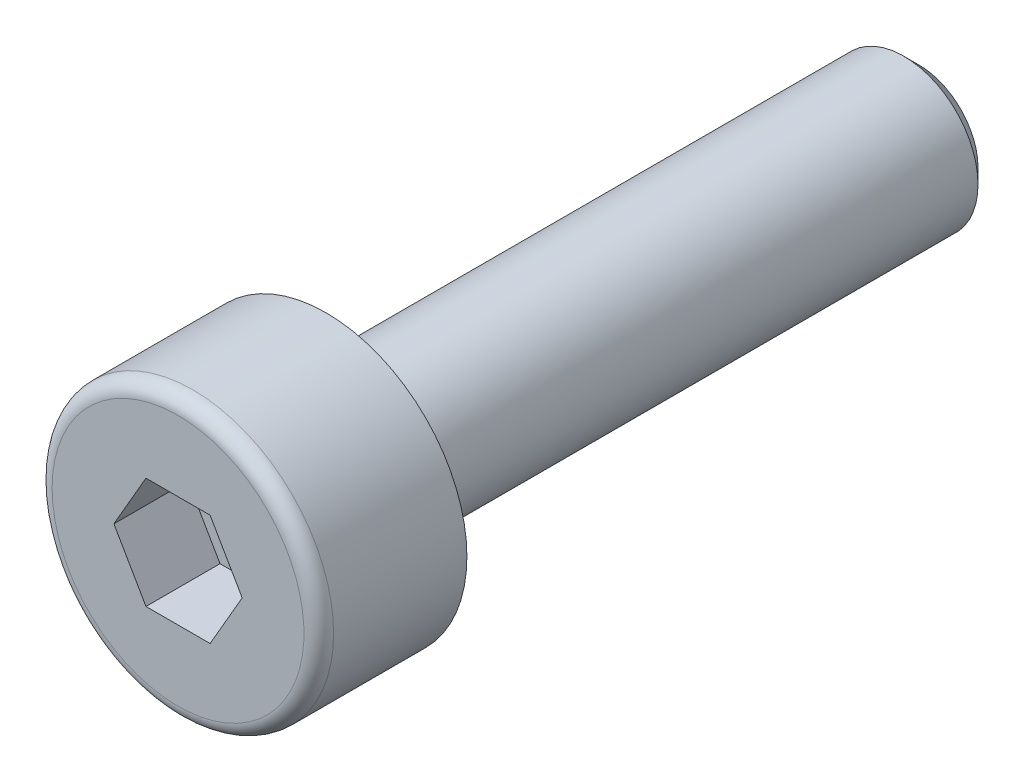
ISO-10303-21;
HEADER;
FILE_DESCRIPTION(('STEP AP214'),'2;1');
FILE_NAME('part.step','',(''),(''),'','','');
FILE_SCHEMA(('AUTOMOTIVE_DESIGN { 1 0 10303 214 1 1 1 1 }'));
ENDSEC;
DATA;
#1=APPLICATION_CONTEXT('core data for automotive mechanical design processes');
#2=APPLICATION_PROTOCOL_DEFINITION('international standard','automotive_design',2000,#1);
#3=PRODUCT_CONTEXT('',#1,'mechanical');
#4=PRODUCT('Part','Part','',(#3));
#5=PRODUCT_RELATED_PRODUCT_CATEGORY('part','',(#4));
#6=PRODUCT_DEFINITION_FORMATION('','',#4);
#7=PRODUCT_DEFINITION_CONTEXT('part definition',#1,'design');
#8=PRODUCT_DEFINITION('design','',#6,#7);
#9=PRODUCT_DEFINITION_SHAPE('','',#8);
#10=(LENGTH_UNIT() NAMED_UNIT(*) SI_UNIT(.MILLI.,.METRE.));
#11=(NAMED_UNIT(*) PLANE_ANGLE_UNIT() SI_UNIT($,.RADIAN.));
#12=(NAMED_UNIT(*) SI_UNIT($,.STERADIAN.) SOLID_ANGLE_UNIT());
#13=UNCERTAINTY_MEASURE_WITH_UNIT(LENGTH_MEASURE(1.E-05),#10,'distance_accuracy_value','');
#14=(GEOMETRIC_REPRESENTATION_CONTEXT(3) GLOBAL_UNCERTAINTY_ASSIGNED_CONTEXT((#13)) GLOBAL_UNIT_ASSIGNED_CONTEXT((#10,
#11,#12)) REPRESENTATION_CONTEXT('',''));
#15=CARTESIAN_POINT('',(0.,0.,0.));
#16=DIRECTION('',(0.,0.,1.));
#17=DIRECTION('',(1.,0.,0.));
#18=AXIS2_PLACEMENT_3D('',#15,#16,#17);
#19=CARTESIAN_POINT('',(0.,0.,0.));
#20=DIRECTION('',(0.,0.,-1.));
#21=DIRECTION('',(-1.,0.,0.));
#22=AXIS2_PLACEMENT_3D('',#19,#20,#21);
#23=PLANE('',#22);
#24=CARTESIAN_POINT('',(0.,0.,0.));
#25=DIRECTION('',(0.,0.,-1.));
#26=DIRECTION('',(-1.,0.,0.));
#27=AXIS2_PLACEMENT_3D('',#24,#25,#26);
#28=CIRCLE('',#27,1.7);
#29=CARTESIAN_POINT('',(-1.7,0.,0.));
#30=VERTEX_POINT('',#29);
#31=EDGE_CURVE('E160',#30,#30,#28,.F.);
#32=ORIENTED_EDGE('',*,*,#31,.T.);
#33=EDGE_LOOP('',(#32));
#34=FACE_BOUND('',#33,.T.);
#35=DIRECTION('',(-0.5,0.866025403784438,0.));
#36=VECTOR('',#35,1.);
#37=CARTESIAN_POINT('',(0.866025403784439,0.,0.));
#38=LINE('',#37,#36);
#39=CARTESIAN_POINT('',(0.866025403784439,0.,0.));
#40=VERTEX_POINT('',#39);
#41=CARTESIAN_POINT('',(0.433012701892219,0.75,0.));
#42=VERTEX_POINT('',#41);
#43=EDGE_CURVE('E135',#40,#42,#38,.T.);
#44=ORIENTED_EDGE('',*,*,#43,.F.);
#45=DIRECTION('',(0.5,0.866025403784439,0.));
#46=VECTOR('',#45,1.);
#47=CARTESIAN_POINT('',(0.433012701892219,-0.750000000000001,0.));
#48=LINE('',#47,#46);
#49=CARTESIAN_POINT('',(0.433012701892219,-0.750000000000001,0.));
#50=VERTEX_POINT('',#49);
#51=EDGE_CURVE('E61',#50,#40,#48,.T.);
#52=ORIENTED_EDGE('',*,*,#51,.F.);
#53=DIRECTION('',(1.,0.,0.));
#54=VECTOR('',#53,1.);
#55=CARTESIAN_POINT('',(-0.433012701892219,-0.750000000000001,0.));
#56=LINE('',#55,#54);
#57=CARTESIAN_POINT('',(-0.433012701892219,-0.750000000000001,0.));
#58=VERTEX_POINT('',#57);
#59=EDGE_CURVE('E144',#58,#50,#56,.T.);
#60=ORIENTED_EDGE('',*,*,#59,.F.);
#61=DIRECTION('',(0.5,-0.866025403784439,0.));
#62=VECTOR('',#61,1.);
#63=CARTESIAN_POINT('',(-0.866025403784438,0.,0.));
#64=LINE('',#63,#62);
#65=CARTESIAN_POINT('',(-0.866025403784438,0.,0.));
#66=VERTEX_POINT('',#65);
#67=EDGE_CURVE('E142',#66,#58,#64,.T.);
#68=ORIENTED_EDGE('',*,*,#67,.F.);
#69=DIRECTION('',(-0.5,-0.866025403784439,0.));
#70=VECTOR('',#69,1.);
#71=CARTESIAN_POINT('',(-0.433012701892219,0.75,0.));
#72=LINE('',#71,#70);
#73=CARTESIAN_POINT('',(-0.433012701892219,0.75,0.));
#74=VERTEX_POINT('',#73);
#75=EDGE_CURVE('E109',#74,#66,#72,.T.);
#76=ORIENTED_EDGE('',*,*,#75,.F.);
#77=DIRECTION('',(-1.,0.,0.));
#78=VECTOR('',#77,1.);
#79=CARTESIAN_POINT('',(0.433012701892219,0.75,0.));
#80=LINE('',#79,#78);
#81=EDGE_CURVE('E138',#42,#74,#80,.T.);
#82=ORIENTED_EDGE('',*,*,#81,.F.);
#83=EDGE_LOOP('',(#44,#52,#60,#68,#76,#82));
#84=FACE_BOUND('',#83,.T.);
#85=ADVANCED_FACE('F45',(#34,#84),#23,.F.);
#86=CARTESIAN_POINT('',(0.,0.,0.));
#87=DIRECTION('',(0.,0.,1.));
#88=DIRECTION('',(1.,0.,0.));
#89=AXIS2_PLACEMENT_3D('',#86,#87,#88);
#90=CYLINDRICAL_SURFACE('',#89,1.9);
#91=CARTESIAN_POINT('',(0.,0.,-0.2));
#92=DIRECTION('',(0.,0.,-1.));
#93=DIRECTION('',(-1.,0.,0.));
#94=AXIS2_PLACEMENT_3D('',#91,#92,#93);
#95=CIRCLE('',#94,1.9);
#96=CARTESIAN_POINT('',(-1.9,0.,-0.2));
#97=VERTEX_POINT('',#96);
#98=EDGE_CURVE('E163',#97,#97,#95,.T.);
#99=ORIENTED_EDGE('',*,*,#98,.T.);
#100=EDGE_LOOP('',(#99));
#101=FACE_BOUND('',#100,.T.);
#102=CARTESIAN_POINT('',(0.,0.,-2.));
#103=DIRECTION('',(0.,0.,1.));
#104=DIRECTION('',(1.,0.,0.));
#105=AXIS2_PLACEMENT_3D('',#102,#103,#104);
#106=CIRCLE('',#105,1.9);
#107=CARTESIAN_POINT('',(1.9,0.,-2.));
#108=VERTEX_POINT('',#107);
#109=EDGE_CURVE('E156',#108,#108,#106,.T.);
#110=ORIENTED_EDGE('',*,*,#109,.T.);
#111=EDGE_LOOP('',(#110));
#112=FACE_BOUND('',#111,.T.);
#113=ADVANCED_FACE('F180',(#101,#112),#90,.T.);
#114=CARTESIAN_POINT('',(0.,1.9,-2.));
#115=DIRECTION('',(0.,0.,1.));
#116=DIRECTION('',(1.,0.,0.));
#117=AXIS2_PLACEMENT_3D('',#114,#115,#116);
#118=PLANE('',#117);
#119=ORIENTED_EDGE('',*,*,#109,.F.);
#120=EDGE_LOOP('',(#119));
#121=FACE_BOUND('',#120,.T.);
#122=CARTESIAN_POINT('',(0.,0.,-2.));
#123=DIRECTION('',(0.,0.,1.));
#124=DIRECTION('',(1.,0.,0.));
#125=AXIS2_PLACEMENT_3D('',#122,#123,#124);
#126=CIRCLE('',#125,1.);
#127=CARTESIAN_POINT('',(1.,0.,-2.));
#128=VERTEX_POINT('',#127);
#129=EDGE_CURVE('E148',#128,#128,#126,.T.);
#130=ORIENTED_EDGE('',*,*,#129,.T.);
#131=EDGE_LOOP('',(#130));
#132=FACE_BOUND('',#131,.T.);
#133=ADVANCED_FACE('F186',(#121,#132),#118,.F.);
#134=CARTESIAN_POINT('',(0.,0.,0.));
#135=DIRECTION('',(0.,0.,1.));
#136=DIRECTION('',(1.,0.,0.));
#137=AXIS2_PLACEMENT_3D('',#134,#135,#136);
#138=CYLINDRICAL_SURFACE('',#137,1.);
#139=CARTESIAN_POINT('',(0.,0.,-9.8));
#140=DIRECTION('',(0.,0.,1.));
#141=DIRECTION('',(1.,0.,0.));
#142=AXIS2_PLACEMENT_3D('',#139,#140,#141);
#143=CIRCLE('',#142,1.);
#144=CARTESIAN_POINT('',(1.,0.,-9.8));
#145=VERTEX_POINT('',#144);
#146=EDGE_CURVE('E54',#145,#145,#143,.T.);
#147=ORIENTED_EDGE('',*,*,#146,.T.);
#148=EDGE_LOOP('',(#147));
#149=FACE_BOUND('',#148,.T.);
#150=ORIENTED_EDGE('',*,*,#129,.F.);
#151=EDGE_LOOP('',(#150));
#152=FACE_BOUND('',#151,.T.);
#153=ADVANCED_FACE('F168',(#149,#152),#138,.T.);
#154=CARTESIAN_POINT('',(0.,1.,-10.));
#155=DIRECTION('',(0.,0.,1.));
#156=DIRECTION('',(1.,0.,0.));
#157=AXIS2_PLACEMENT_3D('',#154,#155,#156);
#158=PLANE('',#157);
#159=CARTESIAN_POINT('',(0.,0.,-10.));
#160=DIRECTION('',(0.,0.,1.));
#161=DIRECTION('',(1.,0.,0.));
#162=AXIS2_PLACEMENT_3D('',#159,#160,#161);
#163=CIRCLE('',#162,0.799999999999999);
#164=CARTESIAN_POINT('',(0.799999999999999,0.,-10.));
#165=VERTEX_POINT('',#164);
#166=EDGE_CURVE('E11',#165,#165,#163,.F.);
#167=ORIENTED_EDGE('',*,*,#166,.T.);
#168=EDGE_LOOP('',(#167));
#169=FACE_BOUND('',#168,.T.);
#170=ADVANCED_FACE('F196',(#169),#158,.F.);
#171=CARTESIAN_POINT('',(0.433012701892219,-0.750000000000001,-1.));
#172=DIRECTION('',(0.866025403784439,-0.5,0.));
#173=DIRECTION('',(0.5,0.866025403784439,0.));
#174=AXIS2_PLACEMENT_3D('',#171,#172,#173);
#175=PLANE('',#174);
#176=ORIENTED_EDGE('',*,*,#51,.T.);
#177=DIRECTION('',(0.,0.,1.));
#178=VECTOR('',#177,1.);
#179=CARTESIAN_POINT('',(0.866025403784439,0.,-1.));
#180=LINE('',#179,#178);
#181=CARTESIAN_POINT('',(0.866025403784439,0.,-1.));
#182=VERTEX_POINT('',#181);
#183=EDGE_CURVE('E91',#182,#40,#180,.T.);
#184=ORIENTED_EDGE('',*,*,#183,.F.);
#185=DIRECTION('',(0.5,0.866025403784439,0.));
#186=VECTOR('',#185,1.);
#187=CARTESIAN_POINT('',(0.433012701892219,-0.750000000000001,-1.));
#188=LINE('',#187,#186);
#189=CARTESIAN_POINT('',(0.433012701892219,-0.750000000000001,-1.));
#190=VERTEX_POINT('',#189);
#191=EDGE_CURVE('E146',#190,#182,#188,.T.);
#192=ORIENTED_EDGE('',*,*,#191,.F.);
#193=DIRECTION('',(0.,0.,1.));
#194=VECTOR('',#193,1.);
#195=CARTESIAN_POINT('',(0.433012701892219,-0.750000000000001,-1.));
#196=LINE('',#195,#194);
#197=EDGE_CURVE('E69',#190,#50,#196,.T.);
#198=ORIENTED_EDGE('',*,*,#197,.T.);
#199=EDGE_LOOP('',(#176,#184,#192,#198));
#200=FACE_BOUND('',#199,.T.);
#201=ADVANCED_FACE('F199',(#200),#175,.F.);
#202=CARTESIAN_POINT('',(-0.433012701892219,-0.750000000000001,-1.));
#203=DIRECTION('',(0.,-1.,0.));
#204=DIRECTION('',(1.,0.,0.));
#205=AXIS2_PLACEMENT_3D('',#202,#203,#204);
#206=PLANE('',#205);
#207=ORIENTED_EDGE('',*,*,#59,.T.);
#208=ORIENTED_EDGE('',*,*,#197,.F.);
#209=DIRECTION('',(1.,0.,0.));
#210=VECTOR('',#209,1.);
#211=CARTESIAN_POINT('',(-0.433012701892219,-0.750000000000001,-1.));
#212=LINE('',#211,#210);
#213=CARTESIAN_POINT('',(-0.433012701892219,-0.750000000000001,-1.));
#214=VERTEX_POINT('',#213);
#215=EDGE_CURVE('E121',#214,#190,#212,.T.);
#216=ORIENTED_EDGE('',*,*,#215,.F.);
#217=DIRECTION('',(0.,0.,1.));
#218=VECTOR('',#217,1.);
#219=CARTESIAN_POINT('',(-0.433012701892219,-0.750000000000001,-1.));
#220=LINE('',#219,#218);
#221=EDGE_CURVE('E113',#214,#58,#220,.T.);
#222=ORIENTED_EDGE('',*,*,#221,.T.);
#223=EDGE_LOOP('',(#207,#208,#216,#222));
#224=FACE_BOUND('',#223,.T.);
#225=ADVANCED_FACE('F203',(#224),#206,.F.);
#226=CARTESIAN_POINT('',(-0.866025403784438,0.,-1.));
#227=DIRECTION('',(-0.866025403784439,-0.5,0.));
#228=DIRECTION('',(0.5,-0.866025403784439,0.));
#229=AXIS2_PLACEMENT_3D('',#226,#227,#228);
#230=PLANE('',#229);
#231=ORIENTED_EDGE('',*,*,#67,.T.);
#232=ORIENTED_EDGE('',*,*,#221,.F.);
#233=DIRECTION('',(0.5,-0.866025403784439,0.));
#234=VECTOR('',#233,1.);
#235=CARTESIAN_POINT('',(-0.866025403784438,0.,-1.));
#236=LINE('',#235,#234);
#237=CARTESIAN_POINT('',(-0.866025403784438,0.,-1.));
#238=VERTEX_POINT('',#237);
#239=EDGE_CURVE('E117',#238,#214,#236,.T.);
#240=ORIENTED_EDGE('',*,*,#239,.F.);
#241=DIRECTION('',(0.,0.,1.));
#242=VECTOR('',#241,1.);
#243=CARTESIAN_POINT('',(-0.866025403784438,0.,-1.));
#244=LINE('',#243,#242);
#245=EDGE_CURVE('E102',#238,#66,#244,.T.);
#246=ORIENTED_EDGE('',*,*,#245,.T.);
#247=EDGE_LOOP('',(#231,#232,#240,#246));
#248=FACE_BOUND('',#247,.T.);
#249=ADVANCED_FACE('F118',(#248),#230,.F.);
#250=CARTESIAN_POINT('',(-0.433012701892219,0.75,-1.));
#251=DIRECTION('',(-0.866025403784439,0.5,0.));
#252=DIRECTION('',(-0.5,-0.866025403784439,0.));
#253=AXIS2_PLACEMENT_3D('',#250,#251,#252);
#254=PLANE('',#253);
#255=ORIENTED_EDGE('',*,*,#75,.T.);
#256=ORIENTED_EDGE('',*,*,#245,.F.);
#257=DIRECTION('',(-0.5,-0.866025403784439,0.));
#258=VECTOR('',#257,1.);
#259=CARTESIAN_POINT('',(-0.433012701892219,0.75,-1.));
#260=LINE('',#259,#258);
#261=CARTESIAN_POINT('',(-0.433012701892219,0.75,-1.));
#262=VERTEX_POINT('',#261);
#263=EDGE_CURVE('E106',#262,#238,#260,.T.);
#264=ORIENTED_EDGE('',*,*,#263,.F.);
#265=DIRECTION('',(0.,0.,1.));
#266=VECTOR('',#265,1.);
#267=CARTESIAN_POINT('',(-0.433012701892219,0.75,-1.));
#268=LINE('',#267,#266);
#269=EDGE_CURVE('E114',#262,#74,#268,.T.);
#270=ORIENTED_EDGE('',*,*,#269,.T.);
#271=EDGE_LOOP('',(#255,#256,#264,#270));
#272=FACE_BOUND('',#271,.T.);
#273=ADVANCED_FACE('F104',(#272),#254,.F.);
#274=CARTESIAN_POINT('',(0.433012701892219,0.75,-1.));
#275=DIRECTION('',(0.,1.,0.));
#276=DIRECTION('',(-1.,0.,0.));
#277=AXIS2_PLACEMENT_3D('',#274,#275,#276);
#278=PLANE('',#277);
#279=ORIENTED_EDGE('',*,*,#81,.T.);
#280=ORIENTED_EDGE('',*,*,#269,.F.);
#281=DIRECTION('',(-1.,0.,0.));
#282=VECTOR('',#281,1.);
#283=CARTESIAN_POINT('',(0.433012701892219,0.75,-1.));
#284=LINE('',#283,#282);
#285=CARTESIAN_POINT('',(0.433012701892219,0.75,-1.));
#286=VERTEX_POINT('',#285);
#287=EDGE_CURVE('E127',#286,#262,#284,.T.);
#288=ORIENTED_EDGE('',*,*,#287,.F.);
#289=DIRECTION('',(0.,0.,1.));
#290=VECTOR('',#289,1.);
#291=CARTESIAN_POINT('',(0.433012701892219,0.75,-1.));
#292=LINE('',#291,#290);
#293=EDGE_CURVE('E151',#286,#42,#292,.T.);
#294=ORIENTED_EDGE('',*,*,#293,.T.);
#295=EDGE_LOOP('',(#279,#280,#288,#294));
#296=FACE_BOUND('',#295,.T.);
#297=ADVANCED_FACE('F207',(#296),#278,.F.);
#298=CARTESIAN_POINT('',(0.866025403784439,0.,-1.));
#299=DIRECTION('',(0.866025403784438,0.5,0.));
#300=DIRECTION('',(-0.5,0.866025403784439,0.));
#301=AXIS2_PLACEMENT_3D('',#298,#299,#300);
#302=PLANE('',#301);
#303=ORIENTED_EDGE('',*,*,#43,.T.);
#304=ORIENTED_EDGE('',*,*,#293,.F.);
#305=DIRECTION('',(-0.5,0.866025403784438,0.));
#306=VECTOR('',#305,1.);
#307=CARTESIAN_POINT('',(0.866025403784439,0.,-1.));
#308=LINE('',#307,#306);
#309=EDGE_CURVE('E129',#182,#286,#308,.T.);
#310=ORIENTED_EDGE('',*,*,#309,.F.);
#311=ORIENTED_EDGE('',*,*,#183,.T.);
#312=EDGE_LOOP('',(#303,#304,#310,#311));
#313=FACE_BOUND('',#312,.T.);
#314=ADVANCED_FACE('F204',(#313),#302,.F.);
#315=CARTESIAN_POINT('',(1.29903810567666,0.75,-1.));
#316=DIRECTION('',(0.,0.,1.));
#317=DIRECTION('',(1.,0.,0.));
#318=AXIS2_PLACEMENT_3D('',#315,#316,#317);
#319=PLANE('',#318);
#320=ORIENTED_EDGE('',*,*,#191,.T.);
#321=ORIENTED_EDGE('',*,*,#309,.T.);
#322=ORIENTED_EDGE('',*,*,#287,.T.);
#323=ORIENTED_EDGE('',*,*,#263,.T.);
#324=ORIENTED_EDGE('',*,*,#239,.T.);
#325=ORIENTED_EDGE('',*,*,#215,.T.);
#326=EDGE_LOOP('',(#320,#321,#322,#323,#324,#325));
#327=FACE_BOUND('',#326,.T.);
#328=ADVANCED_FACE('F124',(#327),#319,.T.);
#329=CARTESIAN_POINT('',(0.,0.,-0.2));
#330=DIRECTION('',(0.,0.,-1.));
#331=DIRECTION('',(-1.,0.,0.));
#332=AXIS2_PLACEMENT_3D('',#329,#330,#331);
#333=TOROIDAL_SURFACE('',#332,1.7,0.2);
#334=ORIENTED_EDGE('',*,*,#98,.F.);
#335=EDGE_LOOP('',(#334));
#336=FACE_BOUND('',#335,.T.);
#337=ORIENTED_EDGE('',*,*,#31,.F.);
#338=EDGE_LOOP('',(#337));
#339=FACE_BOUND('',#338,.T.);
#340=ADVANCED_FACE('F172',(#336,#339),#333,.T.);
#341=CARTESIAN_POINT('',(0.,0.,-9.8));
#342=DIRECTION('',(0.,0.,1.));
#343=DIRECTION('',(1.,0.,0.));
#344=AXIS2_PLACEMENT_3D('',#341,#342,#343);
#345=CONICAL_SURFACE('',#344,1.,0.785398163397446);
#346=ORIENTED_EDGE('',*,*,#166,.F.);
#347=EDGE_LOOP('',(#346));
#348=FACE_BOUND('',#347,.T.);
#349=ORIENTED_EDGE('',*,*,#146,.F.);
#350=EDGE_LOOP('',(#349));
#351=FACE_BOUND('',#350,.T.);
#352=ADVANCED_FACE('F48',(#348,#351),#345,.T.);
#353=CLOSED_SHELL('',(#85,#113,#133,#153,#170,#201,#225,#249,#273,#297,#314,#328,#340,#352));
#354=MANIFOLD_SOLID_BREP('B2',#353);
#355=ADVANCED_BREP_SHAPE_REPRESENTATION('',(#18,#354),#14);
#356=SHAPE_DEFINITION_REPRESENTATION(#9,#355);
ENDSEC;
END-ISO-10303-21;
